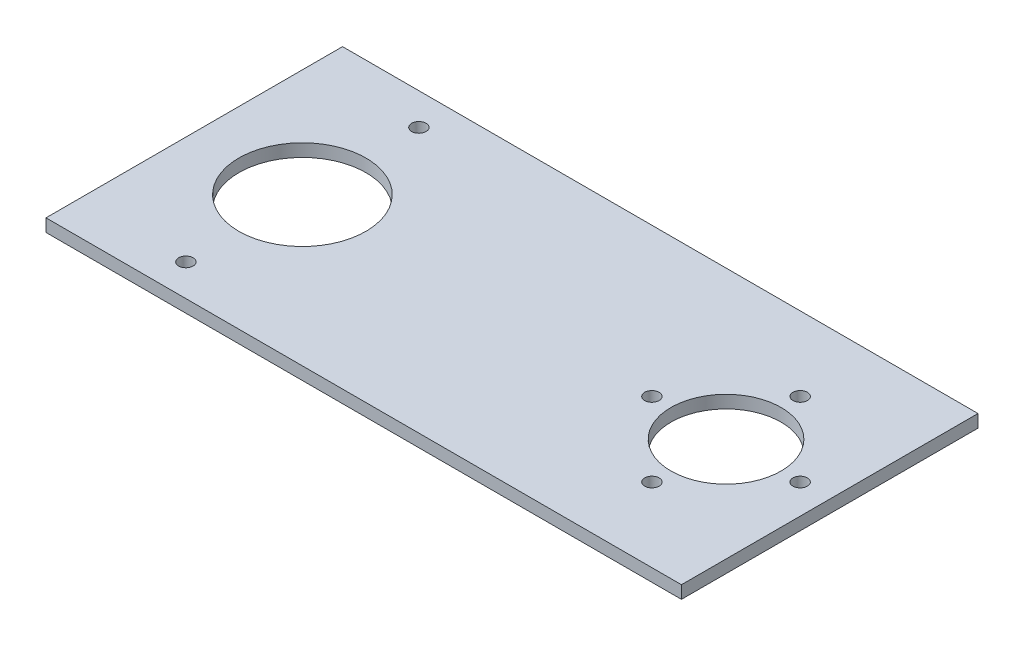
ISO-10303-21;
HEADER;
FILE_DESCRIPTION(('STEP AP214'),'2;1');
FILE_NAME('part.step','',(''),(''),'','','');
FILE_SCHEMA(('AUTOMOTIVE_DESIGN { 1 0 10303 214 1 1 1 1 }'));
ENDSEC;
DATA;
#1=APPLICATION_CONTEXT('core data for automotive mechanical design processes');
#2=APPLICATION_PROTOCOL_DEFINITION('international standard','automotive_design',2000,#1);
#3=PRODUCT_CONTEXT('',#1,'mechanical');
#4=PRODUCT('Part','Part','',(#3));
#5=PRODUCT_RELATED_PRODUCT_CATEGORY('part','',(#4));
#6=PRODUCT_DEFINITION_FORMATION('','',#4);
#7=PRODUCT_DEFINITION_CONTEXT('part definition',#1,'design');
#8=PRODUCT_DEFINITION('design','',#6,#7);
#9=PRODUCT_DEFINITION_SHAPE('','',#8);
#10=(LENGTH_UNIT() NAMED_UNIT(*) SI_UNIT(.MILLI.,.METRE.));
#11=(NAMED_UNIT(*) PLANE_ANGLE_UNIT() SI_UNIT($,.RADIAN.));
#12=(NAMED_UNIT(*) SI_UNIT($,.STERADIAN.) SOLID_ANGLE_UNIT());
#13=UNCERTAINTY_MEASURE_WITH_UNIT(LENGTH_MEASURE(1.E-05),#10,'distance_accuracy_value','');
#14=(GEOMETRIC_REPRESENTATION_CONTEXT(3) GLOBAL_UNCERTAINTY_ASSIGNED_CONTEXT((#13)) GLOBAL_UNIT_ASSIGNED_CONTEXT((#10,
#11,#12)) REPRESENTATION_CONTEXT('',''));
#15=CARTESIAN_POINT('',(0.,0.,0.));
#16=DIRECTION('',(0.,0.,1.));
#17=DIRECTION('',(1.,0.,0.));
#18=AXIS2_PLACEMENT_3D('',#15,#16,#17);
#19=CARTESIAN_POINT('',(0.,0.,0.));
#20=DIRECTION('',(0.,-1.,0.));
#21=DIRECTION('',(0.,0.,-1.));
#22=AXIS2_PLACEMENT_3D('',#19,#20,#21);
#23=PLANE('',#22);
#24=CARTESIAN_POINT('',(25.5221980670726,0.,-62.5));
#25=DIRECTION('',(0.,1.,0.));
#26=DIRECTION('',(0.,0.,1.));
#27=AXIS2_PLACEMENT_3D('',#24,#25,#26);
#28=CIRCLE('',#27,1.69999999999999);
#29=CARTESIAN_POINT('',(25.5221980670726,0.,-60.8));
#30=VERTEX_POINT('',#29);
#31=EDGE_CURVE('E184',#30,#30,#28,.T.);
#32=ORIENTED_EDGE('',*,*,#31,.T.);
#33=EDGE_LOOP('',(#32));
#34=FACE_BOUND('',#33,.T.);
#35=CARTESIAN_POINT('',(25.5221980670726,0.,-7.50000000000001));
#36=DIRECTION('',(0.,1.,0.));
#37=DIRECTION('',(0.,0.,1.));
#38=AXIS2_PLACEMENT_3D('',#35,#36,#37);
#39=CIRCLE('',#38,1.69999999999999);
#40=CARTESIAN_POINT('',(25.5221980670726,0.,-5.80000000000002));
#41=VERTEX_POINT('',#40);
#42=EDGE_CURVE('E176',#41,#41,#39,.T.);
#43=ORIENTED_EDGE('',*,*,#42,.T.);
#44=EDGE_LOOP('',(#43));
#45=FACE_BOUND('',#44,.T.);
#46=CARTESIAN_POINT('',(108.022198067073,0.,-35.));
#47=DIRECTION('',(0.,1.,0.));
#48=DIRECTION('',(0.,0.,1.));
#49=AXIS2_PLACEMENT_3D('',#46,#47,#48);
#50=CIRCLE('',#49,1.69999999999999);
#51=CARTESIAN_POINT('',(108.022198067073,0.,-33.3));
#52=VERTEX_POINT('',#51);
#53=EDGE_CURVE('E168',#52,#52,#50,.T.);
#54=ORIENTED_EDGE('',*,*,#53,.T.);
#55=EDGE_LOOP('',(#54));
#56=FACE_BOUND('',#55,.T.);
#57=CARTESIAN_POINT('',(125.522198067073,0.,-52.5));
#58=DIRECTION('',(0.,1.,0.));
#59=DIRECTION('',(0.,0.,1.));
#60=AXIS2_PLACEMENT_3D('',#57,#58,#59);
#61=CIRCLE('',#60,1.69999999999998);
#62=CARTESIAN_POINT('',(125.522198067073,0.,-50.8));
#63=VERTEX_POINT('',#62);
#64=EDGE_CURVE('E160',#63,#63,#61,.T.);
#65=ORIENTED_EDGE('',*,*,#64,.T.);
#66=EDGE_LOOP('',(#65));
#67=FACE_BOUND('',#66,.T.);
#68=CARTESIAN_POINT('',(143.022198067073,0.,-35.));
#69=DIRECTION('',(0.,1.,0.));
#70=DIRECTION('',(0.,0.,1.));
#71=AXIS2_PLACEMENT_3D('',#68,#69,#70);
#72=CIRCLE('',#71,1.69999999999998);
#73=CARTESIAN_POINT('',(143.022198067073,0.,-33.3));
#74=VERTEX_POINT('',#73);
#75=EDGE_CURVE('E152',#74,#74,#72,.T.);
#76=ORIENTED_EDGE('',*,*,#75,.T.);
#77=EDGE_LOOP('',(#76));
#78=FACE_BOUND('',#77,.T.);
#79=DIRECTION('',(0.,0.,1.));
#80=VECTOR('',#79,1.);
#81=CARTESIAN_POINT('',(0.,0.,0.));
#82=LINE('',#81,#80);
#83=CARTESIAN_POINT('',(0.,0.,-70.));
#84=VERTEX_POINT('',#83);
#85=CARTESIAN_POINT('',(0.,0.,0.));
#86=VERTEX_POINT('',#85);
#87=EDGE_CURVE('E108',#84,#86,#82,.T.);
#88=ORIENTED_EDGE('',*,*,#87,.F.);
#89=DIRECTION('',(-1.,0.,0.));
#90=VECTOR('',#89,1.);
#91=CARTESIAN_POINT('',(0.,0.,-70.));
#92=LINE('',#91,#90);
#93=CARTESIAN_POINT('',(150.,0.,-70.));
#94=VERTEX_POINT('',#93);
#95=EDGE_CURVE('E80',#94,#84,#92,.T.);
#96=ORIENTED_EDGE('',*,*,#95,.F.);
#97=DIRECTION('',(0.,0.,-1.));
#98=VECTOR('',#97,1.);
#99=CARTESIAN_POINT('',(150.,0.,0.));
#100=LINE('',#99,#98);
#101=CARTESIAN_POINT('',(150.,0.,0.));
#102=VERTEX_POINT('',#101);
#103=EDGE_CURVE('E74',#102,#94,#100,.T.);
#104=ORIENTED_EDGE('',*,*,#103,.F.);
#105=DIRECTION('',(1.,0.,0.));
#106=VECTOR('',#105,1.);
#107=CARTESIAN_POINT('',(0.,0.,0.));
#108=LINE('',#107,#106);
#109=EDGE_CURVE('E97',#86,#102,#108,.T.);
#110=ORIENTED_EDGE('',*,*,#109,.F.);
#111=EDGE_LOOP('',(#88,#96,#104,#110));
#112=FACE_BOUND('',#111,.T.);
#113=CARTESIAN_POINT('',(125.522198067073,0.,-35.));
#114=DIRECTION('',(0.,1.,0.));
#115=DIRECTION('',(0.,0.,1.));
#116=AXIS2_PLACEMENT_3D('',#113,#114,#115);
#117=CIRCLE('',#116,13.);
#118=CARTESIAN_POINT('',(125.522198067073,0.,-22.));
#119=VERTEX_POINT('',#118);
#120=EDGE_CURVE('E133',#119,#119,#117,.T.);
#121=ORIENTED_EDGE('',*,*,#120,.T.);
#122=EDGE_LOOP('',(#121));
#123=FACE_BOUND('',#122,.T.);
#124=CARTESIAN_POINT('',(25.5221980670726,0.,-35.));
#125=DIRECTION('',(0.,1.,0.));
#126=DIRECTION('',(0.,0.,1.));
#127=AXIS2_PLACEMENT_3D('',#124,#125,#126);
#128=CIRCLE('',#127,15.);
#129=CARTESIAN_POINT('',(25.5221980670726,0.,-20.));
#130=VERTEX_POINT('',#129);
#131=EDGE_CURVE('E112',#130,#130,#128,.T.);
#132=ORIENTED_EDGE('',*,*,#131,.T.);
#133=EDGE_LOOP('',(#132));
#134=FACE_BOUND('',#133,.T.);
#135=CARTESIAN_POINT('',(125.522198067073,0.,-17.5));
#136=DIRECTION('',(0.,1.,0.));
#137=DIRECTION('',(0.,0.,1.));
#138=AXIS2_PLACEMENT_3D('',#135,#136,#137);
#139=CIRCLE('',#138,1.69999999999998);
#140=CARTESIAN_POINT('',(125.522198067073,0.,-15.8));
#141=VERTEX_POINT('',#140);
#142=EDGE_CURVE('E134',#141,#141,#139,.T.);
#143=ORIENTED_EDGE('',*,*,#142,.T.);
#144=EDGE_LOOP('',(#143));
#145=FACE_BOUND('',#144,.T.);
#146=ADVANCED_FACE('F39',(#34,#45,#56,#67,#78,#112,#123,#134,#145),#23,.T.);
#147=CARTESIAN_POINT('',(0.,3.,0.));
#148=DIRECTION('',(1.,0.,0.));
#149=DIRECTION('',(0.,0.,-1.));
#150=AXIS2_PLACEMENT_3D('',#147,#148,#149);
#151=PLANE('',#150);
#152=ORIENTED_EDGE('',*,*,#87,.T.);
#153=DIRECTION('',(0.,-1.,0.));
#154=VECTOR('',#153,1.);
#155=CARTESIAN_POINT('',(0.,3.,0.));
#156=LINE('',#155,#154);
#157=CARTESIAN_POINT('',(0.,3.,0.));
#158=VERTEX_POINT('',#157);
#159=EDGE_CURVE('E11',#158,#86,#156,.T.);
#160=ORIENTED_EDGE('',*,*,#159,.F.);
#161=DIRECTION('',(0.,0.,1.));
#162=VECTOR('',#161,1.);
#163=CARTESIAN_POINT('',(0.,3.,0.));
#164=LINE('',#163,#162);
#165=CARTESIAN_POINT('',(0.,3.,-70.));
#166=VERTEX_POINT('',#165);
#167=EDGE_CURVE('E92',#166,#158,#164,.T.);
#168=ORIENTED_EDGE('',*,*,#167,.F.);
#169=DIRECTION('',(0.,-1.,0.));
#170=VECTOR('',#169,1.);
#171=CARTESIAN_POINT('',(0.,3.,-70.));
#172=LINE('',#171,#170);
#173=EDGE_CURVE('E104',#166,#84,#172,.T.);
#174=ORIENTED_EDGE('',*,*,#173,.T.);
#175=EDGE_LOOP('',(#152,#160,#168,#174));
#176=FACE_BOUND('',#175,.T.);
#177=ADVANCED_FACE('F41',(#176),#151,.F.);
#178=CARTESIAN_POINT('',(0.,3.,0.));
#179=DIRECTION('',(0.,0.,-1.));
#180=DIRECTION('',(-1.,0.,0.));
#181=AXIS2_PLACEMENT_3D('',#178,#179,#180);
#182=PLANE('',#181);
#183=ORIENTED_EDGE('',*,*,#109,.T.);
#184=DIRECTION('',(0.,-1.,0.));
#185=VECTOR('',#184,1.);
#186=CARTESIAN_POINT('',(150.,3.,0.));
#187=LINE('',#186,#185);
#188=CARTESIAN_POINT('',(150.,3.,0.));
#189=VERTEX_POINT('',#188);
#190=EDGE_CURVE('E49',#189,#102,#187,.T.);
#191=ORIENTED_EDGE('',*,*,#190,.F.);
#192=DIRECTION('',(1.,0.,0.));
#193=VECTOR('',#192,1.);
#194=CARTESIAN_POINT('',(0.,3.,0.));
#195=LINE('',#194,#193);
#196=EDGE_CURVE('E87',#158,#189,#195,.T.);
#197=ORIENTED_EDGE('',*,*,#196,.F.);
#198=ORIENTED_EDGE('',*,*,#159,.T.);
#199=EDGE_LOOP('',(#183,#191,#197,#198));
#200=FACE_BOUND('',#199,.T.);
#201=ADVANCED_FACE('F96',(#200),#182,.F.);
#202=CARTESIAN_POINT('',(150.,3.,0.));
#203=DIRECTION('',(-1.,0.,0.));
#204=DIRECTION('',(0.,0.,1.));
#205=AXIS2_PLACEMENT_3D('',#202,#203,#204);
#206=PLANE('',#205);
#207=ORIENTED_EDGE('',*,*,#103,.T.);
#208=DIRECTION('',(0.,-1.,0.));
#209=VECTOR('',#208,1.);
#210=CARTESIAN_POINT('',(150.,3.,-70.));
#211=LINE('',#210,#209);
#212=CARTESIAN_POINT('',(150.,3.,-70.));
#213=VERTEX_POINT('',#212);
#214=EDGE_CURVE('E99',#213,#94,#211,.T.);
#215=ORIENTED_EDGE('',*,*,#214,.F.);
#216=DIRECTION('',(0.,0.,-1.));
#217=VECTOR('',#216,1.);
#218=CARTESIAN_POINT('',(150.,3.,0.));
#219=LINE('',#218,#217);
#220=EDGE_CURVE('E90',#189,#213,#219,.T.);
#221=ORIENTED_EDGE('',*,*,#220,.F.);
#222=ORIENTED_EDGE('',*,*,#190,.T.);
#223=EDGE_LOOP('',(#207,#215,#221,#222));
#224=FACE_BOUND('',#223,.T.);
#225=ADVANCED_FACE('F100',(#224),#206,.F.);
#226=CARTESIAN_POINT('',(0.,3.,-70.));
#227=DIRECTION('',(0.,0.,1.));
#228=DIRECTION('',(1.,0.,0.));
#229=AXIS2_PLACEMENT_3D('',#226,#227,#228);
#230=PLANE('',#229);
#231=ORIENTED_EDGE('',*,*,#95,.T.);
#232=ORIENTED_EDGE('',*,*,#173,.F.);
#233=DIRECTION('',(-1.,0.,0.));
#234=VECTOR('',#233,1.);
#235=CARTESIAN_POINT('',(0.,3.,-70.));
#236=LINE('',#235,#234);
#237=EDGE_CURVE('E57',#213,#166,#236,.T.);
#238=ORIENTED_EDGE('',*,*,#237,.F.);
#239=ORIENTED_EDGE('',*,*,#214,.T.);
#240=EDGE_LOOP('',(#231,#232,#238,#239));
#241=FACE_BOUND('',#240,.T.);
#242=ADVANCED_FACE('F122',(#241),#230,.F.);
#243=CARTESIAN_POINT('',(0.,3.,0.));
#244=DIRECTION('',(0.,-1.,0.));
#245=DIRECTION('',(0.,0.,-1.));
#246=AXIS2_PLACEMENT_3D('',#243,#244,#245);
#247=PLANE('',#246);
#248=CARTESIAN_POINT('',(25.5221980670726,3.,-62.5));
#249=DIRECTION('',(0.,1.,0.));
#250=DIRECTION('',(0.,0.,1.));
#251=AXIS2_PLACEMENT_3D('',#248,#249,#250);
#252=CIRCLE('',#251,1.69999999999999);
#253=CARTESIAN_POINT('',(25.5221980670726,3.,-60.8));
#254=VERTEX_POINT('',#253);
#255=EDGE_CURVE('E188',#254,#254,#252,.T.);
#256=ORIENTED_EDGE('',*,*,#255,.F.);
#257=EDGE_LOOP('',(#256));
#258=FACE_BOUND('',#257,.T.);
#259=CARTESIAN_POINT('',(25.5221980670726,3.,-7.50000000000001));
#260=DIRECTION('',(0.,1.,0.));
#261=DIRECTION('',(0.,0.,1.));
#262=AXIS2_PLACEMENT_3D('',#259,#260,#261);
#263=CIRCLE('',#262,1.69999999999999);
#264=CARTESIAN_POINT('',(25.5221980670726,3.,-5.80000000000002));
#265=VERTEX_POINT('',#264);
#266=EDGE_CURVE('E180',#265,#265,#263,.T.);
#267=ORIENTED_EDGE('',*,*,#266,.F.);
#268=EDGE_LOOP('',(#267));
#269=FACE_BOUND('',#268,.T.);
#270=CARTESIAN_POINT('',(108.022198067073,3.,-35.));
#271=DIRECTION('',(0.,1.,0.));
#272=DIRECTION('',(0.,0.,1.));
#273=AXIS2_PLACEMENT_3D('',#270,#271,#272);
#274=CIRCLE('',#273,1.69999999999999);
#275=CARTESIAN_POINT('',(108.022198067073,3.,-33.3));
#276=VERTEX_POINT('',#275);
#277=EDGE_CURVE('E172',#276,#276,#274,.T.);
#278=ORIENTED_EDGE('',*,*,#277,.F.);
#279=EDGE_LOOP('',(#278));
#280=FACE_BOUND('',#279,.T.);
#281=CARTESIAN_POINT('',(125.522198067073,3.,-52.5));
#282=DIRECTION('',(0.,1.,0.));
#283=DIRECTION('',(0.,0.,1.));
#284=AXIS2_PLACEMENT_3D('',#281,#282,#283);
#285=CIRCLE('',#284,1.69999999999998);
#286=CARTESIAN_POINT('',(125.522198067073,3.,-50.8));
#287=VERTEX_POINT('',#286);
#288=EDGE_CURVE('E164',#287,#287,#285,.T.);
#289=ORIENTED_EDGE('',*,*,#288,.F.);
#290=EDGE_LOOP('',(#289));
#291=FACE_BOUND('',#290,.T.);
#292=CARTESIAN_POINT('',(143.022198067073,3.,-35.));
#293=DIRECTION('',(0.,1.,0.));
#294=DIRECTION('',(0.,0.,1.));
#295=AXIS2_PLACEMENT_3D('',#292,#293,#294);
#296=CIRCLE('',#295,1.69999999999998);
#297=CARTESIAN_POINT('',(143.022198067073,3.,-33.3));
#298=VERTEX_POINT('',#297);
#299=EDGE_CURVE('E156',#298,#298,#296,.T.);
#300=ORIENTED_EDGE('',*,*,#299,.F.);
#301=EDGE_LOOP('',(#300));
#302=FACE_BOUND('',#301,.T.);
#303=CARTESIAN_POINT('',(125.522198067073,3.,-17.5));
#304=DIRECTION('',(0.,1.,0.));
#305=DIRECTION('',(0.,0.,1.));
#306=AXIS2_PLACEMENT_3D('',#303,#304,#305);
#307=CIRCLE('',#306,1.69999999999998);
#308=CARTESIAN_POINT('',(125.522198067073,3.,-15.8));
#309=VERTEX_POINT('',#308);
#310=EDGE_CURVE('E148',#309,#309,#307,.T.);
#311=ORIENTED_EDGE('',*,*,#310,.F.);
#312=EDGE_LOOP('',(#311));
#313=FACE_BOUND('',#312,.T.);
#314=CARTESIAN_POINT('',(25.5221980670726,3.,-35.));
#315=DIRECTION('',(0.,1.,0.));
#316=DIRECTION('',(0.,0.,1.));
#317=AXIS2_PLACEMENT_3D('',#314,#315,#316);
#318=CIRCLE('',#317,15.);
#319=CARTESIAN_POINT('',(25.5221980670726,3.,-20.));
#320=VERTEX_POINT('',#319);
#321=EDGE_CURVE('E138',#320,#320,#318,.T.);
#322=ORIENTED_EDGE('',*,*,#321,.F.);
#323=EDGE_LOOP('',(#322));
#324=FACE_BOUND('',#323,.T.);
#325=CARTESIAN_POINT('',(125.522198067073,3.,-35.));
#326=DIRECTION('',(0.,1.,0.));
#327=DIRECTION('',(0.,0.,1.));
#328=AXIS2_PLACEMENT_3D('',#325,#326,#327);
#329=CIRCLE('',#328,13.);
#330=CARTESIAN_POINT('',(125.522198067073,3.,-22.));
#331=VERTEX_POINT('',#330);
#332=EDGE_CURVE('E129',#331,#331,#329,.T.);
#333=ORIENTED_EDGE('',*,*,#332,.F.);
#334=EDGE_LOOP('',(#333));
#335=FACE_BOUND('',#334,.T.);
#336=ORIENTED_EDGE('',*,*,#167,.T.);
#337=ORIENTED_EDGE('',*,*,#196,.T.);
#338=ORIENTED_EDGE('',*,*,#220,.T.);
#339=ORIENTED_EDGE('',*,*,#237,.T.);
#340=EDGE_LOOP('',(#336,#337,#338,#339));
#341=FACE_BOUND('',#340,.T.);
#342=ADVANCED_FACE('F88',(#258,#269,#280,#291,#302,#313,#324,#335,#341),#247,.F.);
#343=CARTESIAN_POINT('',(125.522198067073,0.,-35.));
#344=DIRECTION('',(0.,1.,0.));
#345=DIRECTION('',(0.,0.,1.));
#346=AXIS2_PLACEMENT_3D('',#343,#344,#345);
#347=CYLINDRICAL_SURFACE('',#346,13.);
#348=ORIENTED_EDGE('',*,*,#120,.F.);
#349=EDGE_LOOP('',(#348));
#350=FACE_BOUND('',#349,.T.);
#351=ORIENTED_EDGE('',*,*,#332,.T.);
#352=EDGE_LOOP('',(#351));
#353=FACE_BOUND('',#352,.T.);
#354=ADVANCED_FACE('F197',(#350,#353),#347,.F.);
#355=CARTESIAN_POINT('',(25.5221980670726,0.,-35.));
#356=DIRECTION('',(0.,1.,0.));
#357=DIRECTION('',(0.,0.,1.));
#358=AXIS2_PLACEMENT_3D('',#355,#356,#357);
#359=CYLINDRICAL_SURFACE('',#358,15.);
#360=ORIENTED_EDGE('',*,*,#131,.F.);
#361=EDGE_LOOP('',(#360));
#362=FACE_BOUND('',#361,.T.);
#363=ORIENTED_EDGE('',*,*,#321,.T.);
#364=EDGE_LOOP('',(#363));
#365=FACE_BOUND('',#364,.T.);
#366=ADVANCED_FACE('F214',(#362,#365),#359,.F.);
#367=CARTESIAN_POINT('',(125.522198067073,3.,-17.5));
#368=DIRECTION('',(0.,1.,0.));
#369=DIRECTION('',(0.,0.,1.));
#370=AXIS2_PLACEMENT_3D('',#367,#368,#369);
#371=CYLINDRICAL_SURFACE('',#370,1.69999999999998);
#372=ORIENTED_EDGE('',*,*,#142,.F.);
#373=EDGE_LOOP('',(#372));
#374=FACE_BOUND('',#373,.T.);
#375=ORIENTED_EDGE('',*,*,#310,.T.);
#376=EDGE_LOOP('',(#375));
#377=FACE_BOUND('',#376,.T.);
#378=ADVANCED_FACE('F220',(#374,#377),#371,.F.);
#379=CARTESIAN_POINT('',(143.022198067073,3.,-35.));
#380=DIRECTION('',(0.,1.,0.));
#381=DIRECTION('',(0.,0.,1.));
#382=AXIS2_PLACEMENT_3D('',#379,#380,#381);
#383=CYLINDRICAL_SURFACE('',#382,1.69999999999998);
#384=ORIENTED_EDGE('',*,*,#75,.F.);
#385=EDGE_LOOP('',(#384));
#386=FACE_BOUND('',#385,.T.);
#387=ORIENTED_EDGE('',*,*,#299,.T.);
#388=EDGE_LOOP('',(#387));
#389=FACE_BOUND('',#388,.T.);
#390=ADVANCED_FACE('F265',(#386,#389),#383,.F.);
#391=CARTESIAN_POINT('',(125.522198067073,3.,-52.5));
#392=DIRECTION('',(0.,1.,0.));
#393=DIRECTION('',(0.,0.,1.));
#394=AXIS2_PLACEMENT_3D('',#391,#392,#393);
#395=CYLINDRICAL_SURFACE('',#394,1.69999999999998);
#396=ORIENTED_EDGE('',*,*,#64,.F.);
#397=EDGE_LOOP('',(#396));
#398=FACE_BOUND('',#397,.T.);
#399=ORIENTED_EDGE('',*,*,#288,.T.);
#400=EDGE_LOOP('',(#399));
#401=FACE_BOUND('',#400,.T.);
#402=ADVANCED_FACE('F275',(#398,#401),#395,.F.);
#403=CARTESIAN_POINT('',(108.022198067073,3.,-35.));
#404=DIRECTION('',(0.,1.,0.));
#405=DIRECTION('',(0.,0.,1.));
#406=AXIS2_PLACEMENT_3D('',#403,#404,#405);
#407=CYLINDRICAL_SURFACE('',#406,1.69999999999999);
#408=ORIENTED_EDGE('',*,*,#53,.F.);
#409=EDGE_LOOP('',(#408));
#410=FACE_BOUND('',#409,.T.);
#411=ORIENTED_EDGE('',*,*,#277,.T.);
#412=EDGE_LOOP('',(#411));
#413=FACE_BOUND('',#412,.T.);
#414=ADVANCED_FACE('F285',(#410,#413),#407,.F.);
#415=CARTESIAN_POINT('',(25.5221980670726,3.,-7.50000000000001));
#416=DIRECTION('',(0.,1.,0.));
#417=DIRECTION('',(0.,0.,1.));
#418=AXIS2_PLACEMENT_3D('',#415,#416,#417);
#419=CYLINDRICAL_SURFACE('',#418,1.69999999999999);
#420=ORIENTED_EDGE('',*,*,#42,.F.);
#421=EDGE_LOOP('',(#420));
#422=FACE_BOUND('',#421,.T.);
#423=ORIENTED_EDGE('',*,*,#266,.T.);
#424=EDGE_LOOP('',(#423));
#425=FACE_BOUND('',#424,.T.);
#426=ADVANCED_FACE('F295',(#422,#425),#419,.F.);
#427=CARTESIAN_POINT('',(25.5221980670726,3.,-62.5));
#428=DIRECTION('',(0.,1.,0.));
#429=DIRECTION('',(0.,0.,1.));
#430=AXIS2_PLACEMENT_3D('',#427,#428,#429);
#431=CYLINDRICAL_SURFACE('',#430,1.69999999999999);
#432=ORIENTED_EDGE('',*,*,#31,.F.);
#433=EDGE_LOOP('',(#432));
#434=FACE_BOUND('',#433,.T.);
#435=ORIENTED_EDGE('',*,*,#255,.T.);
#436=EDGE_LOOP('',(#435));
#437=FACE_BOUND('',#436,.T.);
#438=ADVANCED_FACE('F193',(#434,#437),#431,.F.);
#439=CLOSED_SHELL('',(#146,#177,#201,#225,#242,#342,#354,#366,#378,#390,#402,#414,#426,#438));
#440=MANIFOLD_SOLID_BREP('B2',#439);
#441=ADVANCED_BREP_SHAPE_REPRESENTATION('',(#18,#440),#14);
#442=SHAPE_DEFINITION_REPRESENTATION(#9,#441);
ENDSEC;
END-ISO-10303-21;
